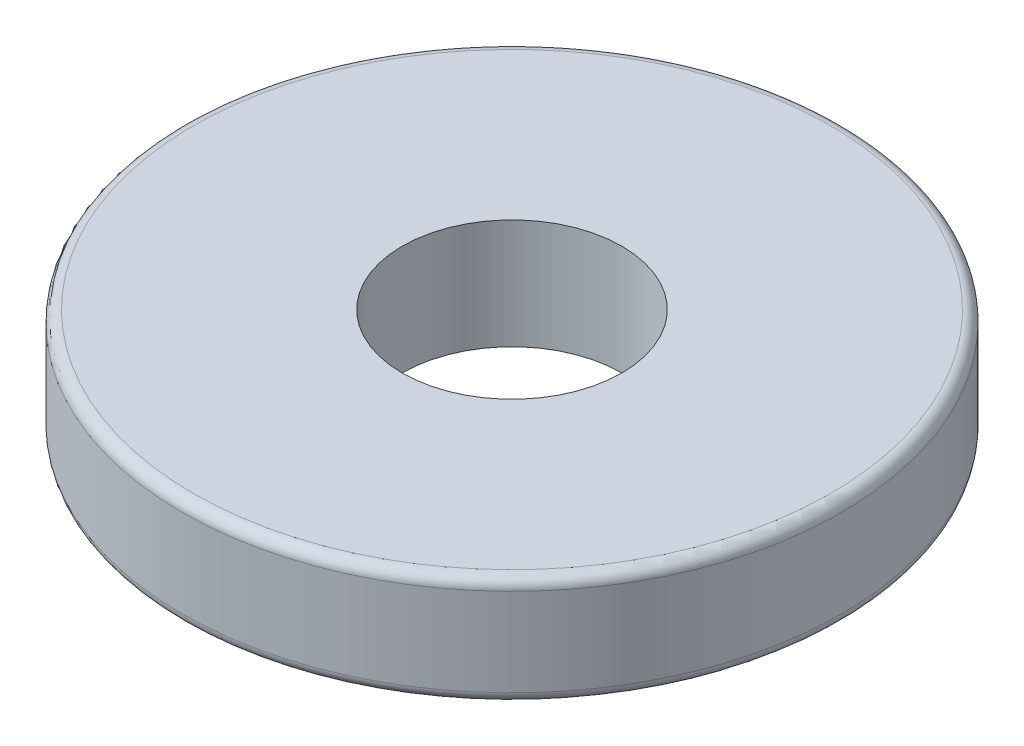
ISO-10303-21;
HEADER;
FILE_DESCRIPTION(('STEP AP214'),'2;1');
FILE_NAME('part.step','',(''),(''),'','','');
FILE_SCHEMA(('AUTOMOTIVE_DESIGN { 1 0 10303 214 1 1 1 1 }'));
ENDSEC;
DATA;
#1=APPLICATION_CONTEXT('core data for automotive mechanical design processes');
#2=APPLICATION_PROTOCOL_DEFINITION('international standard','automotive_design',2000,#1);
#3=PRODUCT_CONTEXT('',#1,'mechanical');
#4=PRODUCT('Part','Part','',(#3));
#5=PRODUCT_RELATED_PRODUCT_CATEGORY('part','',(#4));
#6=PRODUCT_DEFINITION_FORMATION('','',#4);
#7=PRODUCT_DEFINITION_CONTEXT('part definition',#1,'design');
#8=PRODUCT_DEFINITION('design','',#6,#7);
#9=PRODUCT_DEFINITION_SHAPE('','',#8);
#10=(LENGTH_UNIT() NAMED_UNIT(*) SI_UNIT(.MILLI.,.METRE.));
#11=(NAMED_UNIT(*) PLANE_ANGLE_UNIT() SI_UNIT($,.RADIAN.));
#12=(NAMED_UNIT(*) SI_UNIT($,.STERADIAN.) SOLID_ANGLE_UNIT());
#13=UNCERTAINTY_MEASURE_WITH_UNIT(LENGTH_MEASURE(1.E-05),#10,'distance_accuracy_value','');
#14=(GEOMETRIC_REPRESENTATION_CONTEXT(3) GLOBAL_UNCERTAINTY_ASSIGNED_CONTEXT((#13)) GLOBAL_UNIT_ASSIGNED_CONTEXT((#10,
#11,#12)) REPRESENTATION_CONTEXT('',''));
#15=CARTESIAN_POINT('',(0.,0.,0.));
#16=DIRECTION('',(0.,0.,1.));
#17=DIRECTION('',(1.,0.,0.));
#18=AXIS2_PLACEMENT_3D('',#15,#16,#17);
#19=CARTESIAN_POINT('',(10.,20.,10.));
#20=DIRECTION('',(0.,1.,0.));
#21=DIRECTION('',(0.,0.,1.));
#22=AXIS2_PLACEMENT_3D('',#19,#20,#21);
#23=PLANE('',#22);
#24=CARTESIAN_POINT('',(10.,20.,10.));
#25=DIRECTION('',(0.,1.,0.));
#26=DIRECTION('',(0.,0.,1.));
#27=AXIS2_PLACEMENT_3D('',#24,#25,#26);
#28=CIRCLE('',#27,29.);
#29=CARTESIAN_POINT('',(10.,20.,39.));
#30=VERTEX_POINT('',#29);
#31=EDGE_CURVE('E10',#30,#30,#28,.T.);
#32=ORIENTED_EDGE('',*,*,#31,.T.);
#33=EDGE_LOOP('',(#32));
#34=FACE_BOUND('',#33,.T.);
#35=CARTESIAN_POINT('',(10.,20.,10.));
#36=DIRECTION('',(0.,1.,0.));
#37=DIRECTION('',(0.,0.,1.));
#38=AXIS2_PLACEMENT_3D('',#35,#36,#37);
#39=CIRCLE('',#38,10.);
#40=CARTESIAN_POINT('',(10.,20.,20.));
#41=VERTEX_POINT('',#40);
#42=EDGE_CURVE('E60',#41,#41,#39,.T.);
#43=ORIENTED_EDGE('',*,*,#42,.F.);
#44=EDGE_LOOP('',(#43));
#45=FACE_BOUND('',#44,.T.);
#46=ADVANCED_FACE('F36',(#34,#45),#23,.T.);
#47=CARTESIAN_POINT('',(10.,10.,10.));
#48=DIRECTION('',(0.,1.,0.));
#49=DIRECTION('',(0.,0.,1.));
#50=AXIS2_PLACEMENT_3D('',#47,#48,#49);
#51=PLANE('',#50);
#52=CARTESIAN_POINT('',(10.,10.,10.));
#53=DIRECTION('',(0.,1.,0.));
#54=DIRECTION('',(0.,0.,1.));
#55=AXIS2_PLACEMENT_3D('',#52,#53,#54);
#56=CIRCLE('',#55,29.);
#57=CARTESIAN_POINT('',(10.,10.,39.));
#58=VERTEX_POINT('',#57);
#59=EDGE_CURVE('E44',#58,#58,#56,.F.);
#60=ORIENTED_EDGE('',*,*,#59,.T.);
#61=EDGE_LOOP('',(#60));
#62=FACE_BOUND('',#61,.T.);
#63=CARTESIAN_POINT('',(10.,10.,10.));
#64=DIRECTION('',(0.,1.,0.));
#65=DIRECTION('',(0.,0.,1.));
#66=AXIS2_PLACEMENT_3D('',#63,#64,#65);
#67=CIRCLE('',#66,10.);
#68=CARTESIAN_POINT('',(10.,10.,20.));
#69=VERTEX_POINT('',#68);
#70=EDGE_CURVE('E61',#69,#69,#67,.T.);
#71=ORIENTED_EDGE('',*,*,#70,.T.);
#72=EDGE_LOOP('',(#71));
#73=FACE_BOUND('',#72,.T.);
#74=ADVANCED_FACE('F73',(#62,#73),#51,.F.);
#75=CARTESIAN_POINT('',(10.,20.,10.));
#76=DIRECTION('',(0.,-1.,0.));
#77=DIRECTION('',(0.,0.,-1.));
#78=AXIS2_PLACEMENT_3D('',#75,#76,#77);
#79=CYLINDRICAL_SURFACE('',#78,30.);
#80=CARTESIAN_POINT('',(10.,11.,10.));
#81=DIRECTION('',(0.,1.,0.));
#82=DIRECTION('',(0.,0.,1.));
#83=AXIS2_PLACEMENT_3D('',#80,#81,#82);
#84=CIRCLE('',#83,30.);
#85=CARTESIAN_POINT('',(10.,11.,40.));
#86=VERTEX_POINT('',#85);
#87=EDGE_CURVE('E49',#86,#86,#84,.T.);
#88=ORIENTED_EDGE('',*,*,#87,.T.);
#89=EDGE_LOOP('',(#88));
#90=FACE_BOUND('',#89,.T.);
#91=CARTESIAN_POINT('',(10.,19.,10.));
#92=DIRECTION('',(0.,1.,0.));
#93=DIRECTION('',(0.,0.,1.));
#94=AXIS2_PLACEMENT_3D('',#91,#92,#93);
#95=CIRCLE('',#94,30.);
#96=CARTESIAN_POINT('',(10.,19.,40.));
#97=VERTEX_POINT('',#96);
#98=EDGE_CURVE('E54',#97,#97,#95,.F.);
#99=ORIENTED_EDGE('',*,*,#98,.T.);
#100=EDGE_LOOP('',(#99));
#101=FACE_BOUND('',#100,.T.);
#102=ADVANCED_FACE('F79',(#90,#101),#79,.T.);
#103=CARTESIAN_POINT('',(10.,20.,10.));
#104=DIRECTION('',(0.,-1.,0.));
#105=DIRECTION('',(0.,0.,-1.));
#106=AXIS2_PLACEMENT_3D('',#103,#104,#105);
#107=CYLINDRICAL_SURFACE('',#106,10.);
#108=ORIENTED_EDGE('',*,*,#42,.T.);
#109=EDGE_LOOP('',(#108));
#110=FACE_BOUND('',#109,.T.);
#111=ORIENTED_EDGE('',*,*,#70,.F.);
#112=EDGE_LOOP('',(#111));
#113=FACE_BOUND('',#112,.T.);
#114=ADVANCED_FACE('F69',(#110,#113),#107,.F.);
#115=CARTESIAN_POINT('',(10.,11.,10.));
#116=DIRECTION('',(0.,1.,0.));
#117=DIRECTION('',(0.,0.,1.));
#118=AXIS2_PLACEMENT_3D('',#115,#116,#117);
#119=TOROIDAL_SURFACE('',#118,29.,1.);
#120=ORIENTED_EDGE('',*,*,#59,.F.);
#121=EDGE_LOOP('',(#120));
#122=FACE_BOUND('',#121,.T.);
#123=ORIENTED_EDGE('',*,*,#87,.F.);
#124=EDGE_LOOP('',(#123));
#125=FACE_BOUND('',#124,.T.);
#126=ADVANCED_FACE('F85',(#122,#125),#119,.T.);
#127=CARTESIAN_POINT('',(10.,19.,10.));
#128=DIRECTION('',(0.,1.,0.));
#129=DIRECTION('',(0.,0.,1.));
#130=AXIS2_PLACEMENT_3D('',#127,#128,#129);
#131=TOROIDAL_SURFACE('',#130,29.,1.);
#132=ORIENTED_EDGE('',*,*,#98,.F.);
#133=EDGE_LOOP('',(#132));
#134=FACE_BOUND('',#133,.T.);
#135=ORIENTED_EDGE('',*,*,#31,.F.);
#136=EDGE_LOOP('',(#135));
#137=FACE_BOUND('',#136,.T.);
#138=ADVANCED_FACE('F38',(#134,#137),#131,.T.);
#139=CLOSED_SHELL('',(#46,#74,#102,#114,#126,#138));
#140=MANIFOLD_SOLID_BREP('B2',#139);
#141=ADVANCED_BREP_SHAPE_REPRESENTATION('',(#18,#140),#14);
#142=SHAPE_DEFINITION_REPRESENTATION(#9,#141);
ENDSEC;
END-ISO-10303-21;
